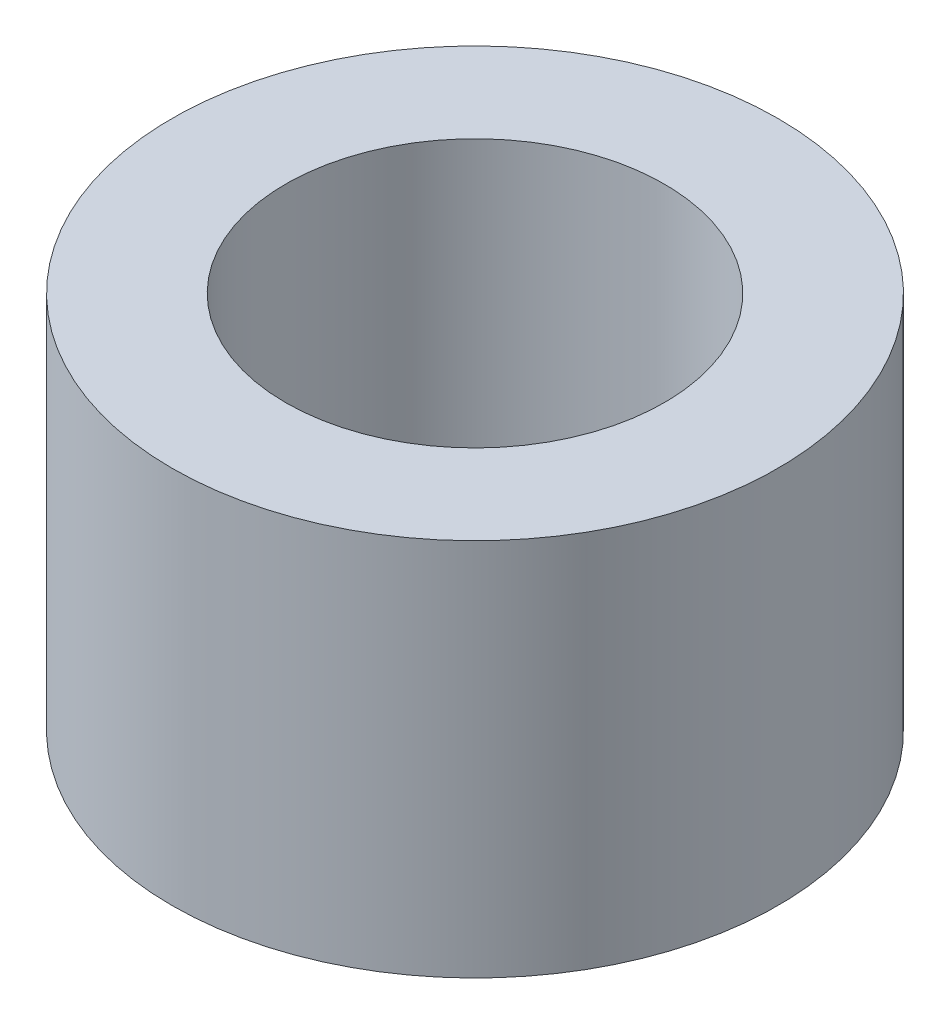
ISO-10303-21;
HEADER;
FILE_DESCRIPTION(('STEP AP214'),'2;1');
FILE_NAME('part.step','',(''),(''),'','','');
FILE_SCHEMA(('AUTOMOTIVE_DESIGN { 1 0 10303 214 1 1 1 1 }'));
ENDSEC;
DATA;
#1=APPLICATION_CONTEXT('core data for automotive mechanical design processes');
#2=APPLICATION_PROTOCOL_DEFINITION('international standard','automotive_design',2000,#1);
#3=PRODUCT_CONTEXT('',#1,'mechanical');
#4=PRODUCT('Part','Part','',(#3));
#5=PRODUCT_RELATED_PRODUCT_CATEGORY('part','',(#4));
#6=PRODUCT_DEFINITION_FORMATION('','',#4);
#7=PRODUCT_DEFINITION_CONTEXT('part definition',#1,'design');
#8=PRODUCT_DEFINITION('design','',#6,#7);
#9=PRODUCT_DEFINITION_SHAPE('','',#8);
#10=(LENGTH_UNIT() NAMED_UNIT(*) SI_UNIT(.MILLI.,.METRE.));
#11=(NAMED_UNIT(*) PLANE_ANGLE_UNIT() SI_UNIT($,.RADIAN.));
#12=(NAMED_UNIT(*) SI_UNIT($,.STERADIAN.) SOLID_ANGLE_UNIT());
#13=UNCERTAINTY_MEASURE_WITH_UNIT(LENGTH_MEASURE(1.E-05),#10,'distance_accuracy_value','');
#14=(GEOMETRIC_REPRESENTATION_CONTEXT(3) GLOBAL_UNCERTAINTY_ASSIGNED_CONTEXT((#13)) GLOBAL_UNIT_ASSIGNED_CONTEXT((#10,
#11,#12)) REPRESENTATION_CONTEXT('',''));
#15=CARTESIAN_POINT('',(0.,0.,0.));
#16=DIRECTION('',(0.,0.,1.));
#17=DIRECTION('',(1.,0.,0.));
#18=AXIS2_PLACEMENT_3D('',#15,#16,#17);
#19=CARTESIAN_POINT('',(0.,5.,0.));
#20=DIRECTION('',(0.,1.,0.));
#21=DIRECTION('',(0.,0.,1.));
#22=AXIS2_PLACEMENT_3D('',#19,#20,#21);
#23=PLANE('',#22);
#24=CARTESIAN_POINT('',(0.,5.,0.));
#25=DIRECTION('',(0.,1.,0.));
#26=DIRECTION('',(0.,0.,1.));
#27=AXIS2_PLACEMENT_3D('',#24,#25,#26);
#28=CIRCLE('',#27,4.);
#29=CARTESIAN_POINT('',(0.,5.,4.));
#30=VERTEX_POINT('',#29);
#31=EDGE_CURVE('E10',#30,#30,#28,.T.);
#32=ORIENTED_EDGE('',*,*,#31,.T.);
#33=EDGE_LOOP('',(#32));
#34=FACE_BOUND('',#33,.T.);
#35=CARTESIAN_POINT('',(0.,5.,0.));
#36=DIRECTION('',(0.,1.,0.));
#37=DIRECTION('',(0.,0.,1.));
#38=AXIS2_PLACEMENT_3D('',#35,#36,#37);
#39=CIRCLE('',#38,2.5);
#40=CARTESIAN_POINT('',(0.,5.,2.5));
#41=VERTEX_POINT('',#40);
#42=EDGE_CURVE('E42',#41,#41,#39,.T.);
#43=ORIENTED_EDGE('',*,*,#42,.F.);
#44=EDGE_LOOP('',(#43));
#45=FACE_BOUND('',#44,.T.);
#46=ADVANCED_FACE('F31',(#34,#45),#23,.T.);
#47=CARTESIAN_POINT('',(0.,0.,0.));
#48=DIRECTION('',(0.,1.,0.));
#49=DIRECTION('',(0.,0.,1.));
#50=AXIS2_PLACEMENT_3D('',#47,#48,#49);
#51=PLANE('',#50);
#52=CARTESIAN_POINT('',(0.,0.,0.));
#53=DIRECTION('',(0.,1.,0.));
#54=DIRECTION('',(0.,0.,1.));
#55=AXIS2_PLACEMENT_3D('',#52,#53,#54);
#56=CIRCLE('',#55,4.);
#57=CARTESIAN_POINT('',(0.,0.,4.));
#58=VERTEX_POINT('',#57);
#59=EDGE_CURVE('E35',#58,#58,#56,.T.);
#60=ORIENTED_EDGE('',*,*,#59,.F.);
#61=EDGE_LOOP('',(#60));
#62=FACE_BOUND('',#61,.T.);
#63=CARTESIAN_POINT('',(0.,0.,0.));
#64=DIRECTION('',(0.,1.,0.));
#65=DIRECTION('',(0.,0.,1.));
#66=AXIS2_PLACEMENT_3D('',#63,#64,#65);
#67=CIRCLE('',#66,2.5);
#68=CARTESIAN_POINT('',(0.,0.,2.5));
#69=VERTEX_POINT('',#68);
#70=EDGE_CURVE('E44',#69,#69,#67,.T.);
#71=ORIENTED_EDGE('',*,*,#70,.T.);
#72=EDGE_LOOP('',(#71));
#73=FACE_BOUND('',#72,.T.);
#74=ADVANCED_FACE('F54',(#62,#73),#51,.F.);
#75=CARTESIAN_POINT('',(0.,5.,0.));
#76=DIRECTION('',(0.,-1.,0.));
#77=DIRECTION('',(0.,0.,-1.));
#78=AXIS2_PLACEMENT_3D('',#75,#76,#77);
#79=CYLINDRICAL_SURFACE('',#78,4.);
#80=ORIENTED_EDGE('',*,*,#31,.F.);
#81=EDGE_LOOP('',(#80));
#82=FACE_BOUND('',#81,.T.);
#83=ORIENTED_EDGE('',*,*,#59,.T.);
#84=EDGE_LOOP('',(#83));
#85=FACE_BOUND('',#84,.T.);
#86=ADVANCED_FACE('F33',(#82,#85),#79,.T.);
#87=CARTESIAN_POINT('',(0.,5.,0.));
#88=DIRECTION('',(0.,-1.,0.));
#89=DIRECTION('',(0.,0.,-1.));
#90=AXIS2_PLACEMENT_3D('',#87,#88,#89);
#91=CYLINDRICAL_SURFACE('',#90,2.5);
#92=ORIENTED_EDGE('',*,*,#42,.T.);
#93=EDGE_LOOP('',(#92));
#94=FACE_BOUND('',#93,.T.);
#95=ORIENTED_EDGE('',*,*,#70,.F.);
#96=EDGE_LOOP('',(#95));
#97=FACE_BOUND('',#96,.T.);
#98=ADVANCED_FACE('F50',(#94,#97),#91,.F.);
#99=CLOSED_SHELL('',(#46,#74,#86,#98));
#100=MANIFOLD_SOLID_BREP('B2',#99);
#101=ADVANCED_BREP_SHAPE_REPRESENTATION('',(#18,#100),#14);
#102=SHAPE_DEFINITION_REPRESENTATION(#9,#101);
ENDSEC;
END-ISO-10303-21;
